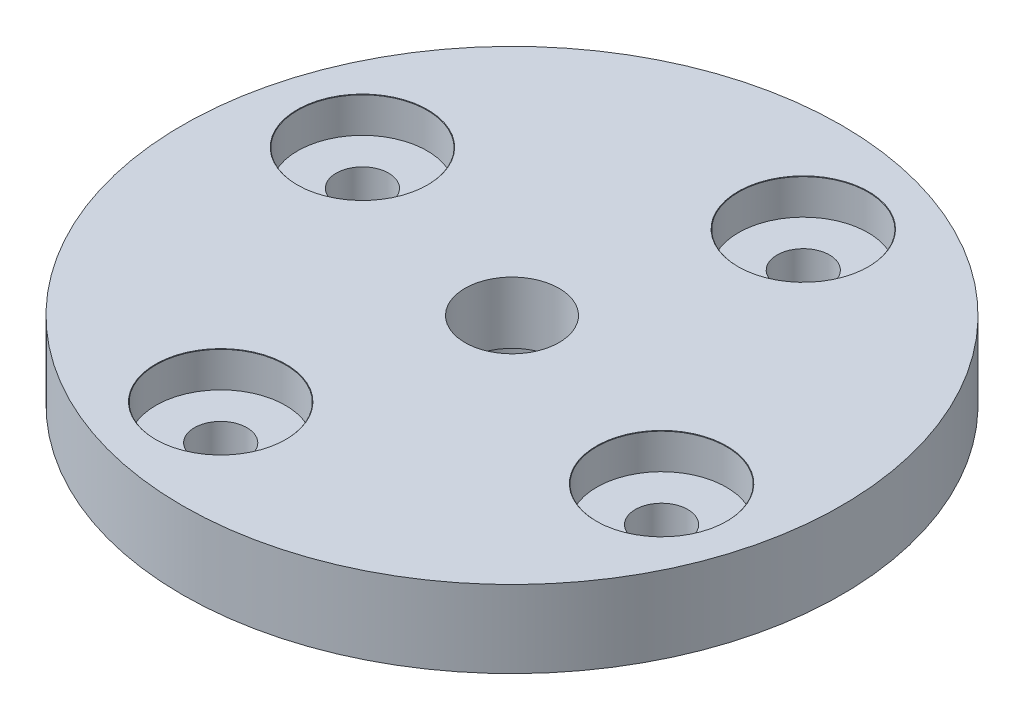
ISO-10303-21;
HEADER;
FILE_DESCRIPTION(('STEP AP214'),'2;1');
FILE_NAME('part.step','',(''),(''),'','','');
FILE_SCHEMA(('AUTOMOTIVE_DESIGN { 1 0 10303 214 1 1 1 1 }'));
ENDSEC;
DATA;
#1=APPLICATION_CONTEXT('core data for automotive mechanical design processes');
#2=APPLICATION_PROTOCOL_DEFINITION('international standard','automotive_design',2000,#1);
#3=PRODUCT_CONTEXT('',#1,'mechanical');
#4=PRODUCT('Part','Part','',(#3));
#5=PRODUCT_RELATED_PRODUCT_CATEGORY('part','',(#4));
#6=PRODUCT_DEFINITION_FORMATION('','',#4);
#7=PRODUCT_DEFINITION_CONTEXT('part definition',#1,'design');
#8=PRODUCT_DEFINITION('design','',#6,#7);
#9=PRODUCT_DEFINITION_SHAPE('','',#8);
#10=(LENGTH_UNIT() NAMED_UNIT(*) SI_UNIT(.MILLI.,.METRE.));
#11=(NAMED_UNIT(*) PLANE_ANGLE_UNIT() SI_UNIT($,.RADIAN.));
#12=(NAMED_UNIT(*) SI_UNIT($,.STERADIAN.) SOLID_ANGLE_UNIT());
#13=UNCERTAINTY_MEASURE_WITH_UNIT(LENGTH_MEASURE(1.E-05),#10,'distance_accuracy_value','');
#14=(GEOMETRIC_REPRESENTATION_CONTEXT(3) GLOBAL_UNCERTAINTY_ASSIGNED_CONTEXT((#13)) GLOBAL_UNIT_ASSIGNED_CONTEXT((#10,
#11,#12)) REPRESENTATION_CONTEXT('',''));
#15=CARTESIAN_POINT('',(0.,0.,0.));
#16=DIRECTION('',(0.,0.,1.));
#17=DIRECTION('',(1.,0.,0.));
#18=AXIS2_PLACEMENT_3D('',#15,#16,#17);
#19=CARTESIAN_POINT('',(21.35,0.,0.));
#20=DIRECTION('',(0.,-1.,0.));
#21=DIRECTION('',(0.,0.,-1.));
#22=AXIS2_PLACEMENT_3D('',#19,#20,#21);
#23=PLANE('',#22);
#24=CARTESIAN_POINT('',(4.59022107462861,0.,-14.2804016220145));
#25=DIRECTION('',(0.,1.,0.));
#26=DIRECTION('',(0.,0.,1.));
#27=AXIS2_PLACEMENT_3D('',#24,#25,#26);
#28=CIRCLE('',#27,1.7);
#29=CARTESIAN_POINT('',(4.59022107462861,0.,-12.5804016220145));
#30=VERTEX_POINT('',#29);
#31=EDGE_CURVE('E110',#30,#30,#28,.T.);
#32=ORIENTED_EDGE('',*,*,#31,.T.);
#33=EDGE_LOOP('',(#32));
#34=FACE_BOUND('',#33,.T.);
#35=CARTESIAN_POINT('',(-14.2804016220145,0.,-4.59022107462861));
#36=DIRECTION('',(0.,1.,0.));
#37=DIRECTION('',(0.,0.,1.));
#38=AXIS2_PLACEMENT_3D('',#35,#36,#37);
#39=CIRCLE('',#38,1.7);
#40=CARTESIAN_POINT('',(-14.2804016220145,0.,-2.89022107462861));
#41=VERTEX_POINT('',#40);
#42=EDGE_CURVE('E95',#41,#41,#39,.T.);
#43=ORIENTED_EDGE('',*,*,#42,.T.);
#44=EDGE_LOOP('',(#43));
#45=FACE_BOUND('',#44,.T.);
#46=CARTESIAN_POINT('',(14.2804016220145,0.,4.59022107462861));
#47=DIRECTION('',(0.,1.,0.));
#48=DIRECTION('',(0.,0.,1.));
#49=AXIS2_PLACEMENT_3D('',#46,#47,#48);
#50=CIRCLE('',#49,1.7);
#51=CARTESIAN_POINT('',(14.2804016220145,0.,6.2902210746286));
#52=VERTEX_POINT('',#51);
#53=EDGE_CURVE('E76',#52,#52,#50,.T.);
#54=ORIENTED_EDGE('',*,*,#53,.T.);
#55=EDGE_LOOP('',(#54));
#56=FACE_BOUND('',#55,.T.);
#57=CARTESIAN_POINT('',(-4.59022107462861,0.,14.2804016220145));
#58=DIRECTION('',(0.,1.,0.));
#59=DIRECTION('',(0.,0.,1.));
#60=AXIS2_PLACEMENT_3D('',#57,#58,#59);
#61=CIRCLE('',#60,1.7);
#62=CARTESIAN_POINT('',(-4.59022107462861,0.,15.9804016220145));
#63=VERTEX_POINT('',#62);
#64=EDGE_CURVE('E61',#63,#63,#61,.T.);
#65=ORIENTED_EDGE('',*,*,#64,.T.);
#66=EDGE_LOOP('',(#65));
#67=FACE_BOUND('',#66,.T.);
#68=CARTESIAN_POINT('',(0.,0.,0.));
#69=DIRECTION('',(0.,-1.,0.));
#70=DIRECTION('',(0.,0.,-1.));
#71=AXIS2_PLACEMENT_3D('',#68,#69,#70);
#72=CIRCLE('',#71,21.35);
#73=CARTESIAN_POINT('',(0.,0.,-21.35));
#74=VERTEX_POINT('',#73);
#75=EDGE_CURVE('E56',#74,#74,#72,.T.);
#76=ORIENTED_EDGE('',*,*,#75,.T.);
#77=EDGE_LOOP('',(#76));
#78=FACE_BOUND('',#77,.T.);
#79=CARTESIAN_POINT('',(0.,0.,0.));
#80=DIRECTION('',(0.,-1.,0.));
#81=DIRECTION('',(0.,0.,-1.));
#82=AXIS2_PLACEMENT_3D('',#79,#80,#81);
#83=CIRCLE('',#82,4.);
#84=CARTESIAN_POINT('',(0.,0.,-4.));
#85=VERTEX_POINT('',#84);
#86=EDGE_CURVE('E10',#85,#85,#83,.T.);
#87=ORIENTED_EDGE('',*,*,#86,.F.);
#88=EDGE_LOOP('',(#87));
#89=FACE_BOUND('',#88,.T.);
#90=ADVANCED_FACE('F40',(#34,#45,#56,#67,#78,#89),#23,.T.);
#91=CARTESIAN_POINT('',(0.,0.,0.));
#92=DIRECTION('',(0.,-1.,0.));
#93=DIRECTION('',(0.,0.,-1.));
#94=AXIS2_PLACEMENT_3D('',#91,#92,#93);
#95=CYLINDRICAL_SURFACE('',#94,4.);
#96=ORIENTED_EDGE('',*,*,#86,.T.);
#97=EDGE_LOOP('',(#96));
#98=FACE_BOUND('',#97,.T.);
#99=CARTESIAN_POINT('',(0.,0.999999999999997,0.));
#100=DIRECTION('',(0.,-1.,0.));
#101=DIRECTION('',(0.,0.,-1.));
#102=AXIS2_PLACEMENT_3D('',#99,#100,#101);
#103=CIRCLE('',#102,4.);
#104=CARTESIAN_POINT('',(0.,0.999999999999997,-4.));
#105=VERTEX_POINT('',#104);
#106=EDGE_CURVE('E43',#105,#105,#103,.T.);
#107=ORIENTED_EDGE('',*,*,#106,.F.);
#108=EDGE_LOOP('',(#107));
#109=FACE_BOUND('',#108,.T.);
#110=ADVANCED_FACE('F149',(#98,#109),#95,.F.);
#111=CARTESIAN_POINT('',(4.,0.999999999999997,0.));
#112=DIRECTION('',(0.,-1.,0.));
#113=DIRECTION('',(0.,0.,-1.));
#114=AXIS2_PLACEMENT_3D('',#111,#112,#113);
#115=PLANE('',#114);
#116=ORIENTED_EDGE('',*,*,#106,.T.);
#117=EDGE_LOOP('',(#116));
#118=FACE_BOUND('',#117,.T.);
#119=CARTESIAN_POINT('',(0.,0.999999999999997,0.));
#120=DIRECTION('',(0.,-1.,0.));
#121=DIRECTION('',(0.,0.,-1.));
#122=AXIS2_PLACEMENT_3D('',#119,#120,#121);
#123=CIRCLE('',#122,3.048);
#124=CARTESIAN_POINT('',(0.,0.999999999999997,-3.048));
#125=VERTEX_POINT('',#124);
#126=EDGE_CURVE('E50',#125,#125,#123,.T.);
#127=ORIENTED_EDGE('',*,*,#126,.F.);
#128=EDGE_LOOP('',(#127));
#129=FACE_BOUND('',#128,.T.);
#130=ADVANCED_FACE('F152',(#118,#129),#115,.T.);
#131=CARTESIAN_POINT('',(0.,0.,0.));
#132=DIRECTION('',(0.,-1.,0.));
#133=DIRECTION('',(0.,0.,-1.));
#134=AXIS2_PLACEMENT_3D('',#131,#132,#133);
#135=CYLINDRICAL_SURFACE('',#134,3.048);
#136=ORIENTED_EDGE('',*,*,#126,.T.);
#137=EDGE_LOOP('',(#136));
#138=FACE_BOUND('',#137,.T.);
#139=CARTESIAN_POINT('',(0.,5.,0.));
#140=DIRECTION('',(0.,-1.,0.));
#141=DIRECTION('',(0.,0.,-1.));
#142=AXIS2_PLACEMENT_3D('',#139,#140,#141);
#143=CIRCLE('',#142,3.048);
#144=CARTESIAN_POINT('',(0.,5.,-3.048));
#145=VERTEX_POINT('',#144);
#146=EDGE_CURVE('E51',#145,#145,#143,.T.);
#147=ORIENTED_EDGE('',*,*,#146,.F.);
#148=EDGE_LOOP('',(#147));
#149=FACE_BOUND('',#148,.T.);
#150=ADVANCED_FACE('F129',(#138,#149),#135,.F.);
#151=CARTESIAN_POINT('',(21.35,5.,0.));
#152=DIRECTION('',(0.,1.,0.));
#153=DIRECTION('',(0.,0.,1.));
#154=AXIS2_PLACEMENT_3D('',#151,#152,#153);
#155=PLANE('',#154);
#156=CARTESIAN_POINT('',(4.59022107462861,5.,-14.2804016220145));
#157=DIRECTION('',(0.,1.,0.));
#158=DIRECTION('',(0.,0.,1.));
#159=AXIS2_PLACEMENT_3D('',#156,#157,#158);
#160=CIRCLE('',#159,4.225);
#161=CARTESIAN_POINT('',(4.59022107462861,5.,-10.0554016220145));
#162=VERTEX_POINT('',#161);
#163=EDGE_CURVE('E118',#162,#162,#160,.T.);
#164=ORIENTED_EDGE('',*,*,#163,.F.);
#165=EDGE_LOOP('',(#164));
#166=FACE_BOUND('',#165,.T.);
#167=CARTESIAN_POINT('',(-14.2804016220145,5.,-4.59022107462861));
#168=DIRECTION('',(0.,1.,0.));
#169=DIRECTION('',(0.,0.,1.));
#170=AXIS2_PLACEMENT_3D('',#167,#168,#169);
#171=CIRCLE('',#170,4.225);
#172=CARTESIAN_POINT('',(-14.2804016220145,5.,-0.36522107462861));
#173=VERTEX_POINT('',#172);
#174=EDGE_CURVE('E102',#173,#173,#171,.T.);
#175=ORIENTED_EDGE('',*,*,#174,.F.);
#176=EDGE_LOOP('',(#175));
#177=FACE_BOUND('',#176,.T.);
#178=CARTESIAN_POINT('',(14.2804016220145,5.,4.59022107462861));
#179=DIRECTION('',(0.,1.,0.));
#180=DIRECTION('',(0.,0.,1.));
#181=AXIS2_PLACEMENT_3D('',#178,#179,#180);
#182=CIRCLE('',#181,4.225);
#183=CARTESIAN_POINT('',(14.2804016220145,5.,8.8152210746286));
#184=VERTEX_POINT('',#183);
#185=EDGE_CURVE('E90',#184,#184,#182,.T.);
#186=ORIENTED_EDGE('',*,*,#185,.F.);
#187=EDGE_LOOP('',(#186));
#188=FACE_BOUND('',#187,.T.);
#189=CARTESIAN_POINT('',(-4.59022107462861,5.,14.2804016220145));
#190=DIRECTION('',(0.,1.,0.));
#191=DIRECTION('',(0.,0.,1.));
#192=AXIS2_PLACEMENT_3D('',#189,#190,#191);
#193=CIRCLE('',#192,4.225);
#194=CARTESIAN_POINT('',(-4.59022107462861,5.,18.5054016220145));
#195=VERTEX_POINT('',#194);
#196=EDGE_CURVE('E74',#195,#195,#193,.T.);
#197=ORIENTED_EDGE('',*,*,#196,.F.);
#198=EDGE_LOOP('',(#197));
#199=FACE_BOUND('',#198,.T.);
#200=ORIENTED_EDGE('',*,*,#146,.T.);
#201=EDGE_LOOP('',(#200));
#202=FACE_BOUND('',#201,.T.);
#203=CARTESIAN_POINT('',(0.,5.,0.));
#204=DIRECTION('',(0.,-1.,0.));
#205=DIRECTION('',(0.,0.,-1.));
#206=AXIS2_PLACEMENT_3D('',#203,#204,#205);
#207=CIRCLE('',#206,21.35);
#208=CARTESIAN_POINT('',(0.,5.,-21.35));
#209=VERTEX_POINT('',#208);
#210=EDGE_CURVE('E57',#209,#209,#207,.T.);
#211=ORIENTED_EDGE('',*,*,#210,.F.);
#212=EDGE_LOOP('',(#211));
#213=FACE_BOUND('',#212,.T.);
#214=ADVANCED_FACE('F124',(#166,#177,#188,#199,#202,#213),#155,.T.);
#215=CARTESIAN_POINT('',(0.,0.,0.));
#216=DIRECTION('',(0.,-1.,0.));
#217=DIRECTION('',(0.,0.,-1.));
#218=AXIS2_PLACEMENT_3D('',#215,#216,#217);
#219=CYLINDRICAL_SURFACE('',#218,21.35);
#220=ORIENTED_EDGE('',*,*,#210,.T.);
#221=EDGE_LOOP('',(#220));
#222=FACE_BOUND('',#221,.T.);
#223=ORIENTED_EDGE('',*,*,#75,.F.);
#224=EDGE_LOOP('',(#223));
#225=FACE_BOUND('',#224,.T.);
#226=ADVANCED_FACE('F126',(#222,#225),#219,.T.);
#227=CARTESIAN_POINT('',(-4.59022107462861,5.,14.2804016220145));
#228=DIRECTION('',(0.,1.,0.));
#229=DIRECTION('',(0.,0.,1.));
#230=AXIS2_PLACEMENT_3D('',#227,#228,#229);
#231=CYLINDRICAL_SURFACE('',#230,1.70000000000001);
#232=ORIENTED_EDGE('',*,*,#64,.F.);
#233=EDGE_LOOP('',(#232));
#234=FACE_BOUND('',#233,.T.);
#235=CARTESIAN_POINT('',(-4.59022107462861,2.70000000000001,14.2804016220145));
#236=DIRECTION('',(0.,1.,0.));
#237=DIRECTION('',(0.,0.,1.));
#238=AXIS2_PLACEMENT_3D('',#235,#236,#237);
#239=CIRCLE('',#238,1.70000000000001);
#240=CARTESIAN_POINT('',(-4.59022107462861,2.70000000000001,15.9804016220145));
#241=VERTEX_POINT('',#240);
#242=EDGE_CURVE('E62',#241,#241,#239,.T.);
#243=ORIENTED_EDGE('',*,*,#242,.T.);
#244=EDGE_LOOP('',(#243));
#245=FACE_BOUND('',#244,.T.);
#246=ADVANCED_FACE('F141',(#234,#245),#231,.F.);
#247=CARTESIAN_POINT('',(-0.390221074628614,2.70000000000001,14.2804016220145));
#248=DIRECTION('',(0.,-1.,0.));
#249=DIRECTION('',(0.,0.,-1.));
#250=AXIS2_PLACEMENT_3D('',#247,#248,#249);
#251=PLANE('',#250);
#252=ORIENTED_EDGE('',*,*,#242,.F.);
#253=EDGE_LOOP('',(#252));
#254=FACE_BOUND('',#253,.T.);
#255=CARTESIAN_POINT('',(-4.59022107462861,2.70000000000001,14.2804016220145));
#256=DIRECTION('',(0.,1.,0.));
#257=DIRECTION('',(0.,0.,1.));
#258=AXIS2_PLACEMENT_3D('',#255,#256,#257);
#259=CIRCLE('',#258,4.2);
#260=CARTESIAN_POINT('',(-4.59022107462861,2.70000000000001,18.4804016220145));
#261=VERTEX_POINT('',#260);
#262=EDGE_CURVE('E68',#261,#261,#259,.T.);
#263=ORIENTED_EDGE('',*,*,#262,.T.);
#264=EDGE_LOOP('',(#263));
#265=FACE_BOUND('',#264,.T.);
#266=ADVANCED_FACE('F164',(#254,#265),#251,.F.);
#267=CARTESIAN_POINT('',(-4.59022107462861,5.,14.2804016220145));
#268=DIRECTION('',(0.,1.,0.));
#269=DIRECTION('',(0.,0.,1.));
#270=AXIS2_PLACEMENT_3D('',#267,#268,#269);
#271=CYLINDRICAL_SURFACE('',#270,4.2);
#272=ORIENTED_EDGE('',*,*,#262,.F.);
#273=EDGE_LOOP('',(#272));
#274=FACE_BOUND('',#273,.T.);
#275=CARTESIAN_POINT('',(-4.59022107462861,4.97500000000001,14.2804016220145));
#276=DIRECTION('',(0.,1.,0.));
#277=DIRECTION('',(0.,0.,1.));
#278=AXIS2_PLACEMENT_3D('',#275,#276,#277);
#279=CIRCLE('',#278,4.2);
#280=CARTESIAN_POINT('',(-4.59022107462861,4.97500000000001,18.4804016220145));
#281=VERTEX_POINT('',#280);
#282=EDGE_CURVE('E72',#281,#281,#279,.T.);
#283=ORIENTED_EDGE('',*,*,#282,.T.);
#284=EDGE_LOOP('',(#283));
#285=FACE_BOUND('',#284,.T.);
#286=ADVANCED_FACE('F174',(#274,#285),#271,.F.);
#287=CARTESIAN_POINT('',(-4.59022107462861,5.,14.2804016220145));
#288=DIRECTION('',(0.,1.,0.));
#289=DIRECTION('',(0.,0.,1.));
#290=AXIS2_PLACEMENT_3D('',#287,#288,#289);
#291=CONICAL_SURFACE('',#290,4.225,0.785398163397552);
#292=ORIENTED_EDGE('',*,*,#282,.F.);
#293=EDGE_LOOP('',(#292));
#294=FACE_BOUND('',#293,.T.);
#295=ORIENTED_EDGE('',*,*,#196,.T.);
#296=EDGE_LOOP('',(#295));
#297=FACE_BOUND('',#296,.T.);
#298=ADVANCED_FACE('F180',(#294,#297),#291,.F.);
#299=CARTESIAN_POINT('',(14.2804016220145,5.,4.59022107462861));
#300=DIRECTION('',(0.,1.,0.));
#301=DIRECTION('',(0.,0.,1.));
#302=AXIS2_PLACEMENT_3D('',#299,#300,#301);
#303=CYLINDRICAL_SURFACE('',#302,1.70000000000001);
#304=ORIENTED_EDGE('',*,*,#53,.F.);
#305=EDGE_LOOP('',(#304));
#306=FACE_BOUND('',#305,.T.);
#307=CARTESIAN_POINT('',(14.2804016220145,2.70000000000001,4.59022107462861));
#308=DIRECTION('',(0.,1.,0.));
#309=DIRECTION('',(0.,0.,1.));
#310=AXIS2_PLACEMENT_3D('',#307,#308,#309);
#311=CIRCLE('',#310,1.70000000000001);
#312=CARTESIAN_POINT('',(14.2804016220145,2.70000000000001,6.29022107462862));
#313=VERTEX_POINT('',#312);
#314=EDGE_CURVE('E77',#313,#313,#311,.T.);
#315=ORIENTED_EDGE('',*,*,#314,.T.);
#316=EDGE_LOOP('',(#315));
#317=FACE_BOUND('',#316,.T.);
#318=ADVANCED_FACE('F181',(#306,#317),#303,.F.);
#319=CARTESIAN_POINT('',(18.4804016220145,2.70000000000001,4.59022107462861));
#320=DIRECTION('',(0.,-1.,0.));
#321=DIRECTION('',(0.,0.,-1.));
#322=AXIS2_PLACEMENT_3D('',#319,#320,#321);
#323=PLANE('',#322);
#324=ORIENTED_EDGE('',*,*,#314,.F.);
#325=EDGE_LOOP('',(#324));
#326=FACE_BOUND('',#325,.T.);
#327=CARTESIAN_POINT('',(14.2804016220145,2.70000000000001,4.59022107462861));
#328=DIRECTION('',(0.,1.,0.));
#329=DIRECTION('',(0.,0.,1.));
#330=AXIS2_PLACEMENT_3D('',#327,#328,#329);
#331=CIRCLE('',#330,4.2);
#332=CARTESIAN_POINT('',(14.2804016220145,2.70000000000001,8.7902210746286));
#333=VERTEX_POINT('',#332);
#334=EDGE_CURVE('E83',#333,#333,#331,.T.);
#335=ORIENTED_EDGE('',*,*,#334,.T.);
#336=EDGE_LOOP('',(#335));
#337=FACE_BOUND('',#336,.T.);
#338=ADVANCED_FACE('F190',(#326,#337),#323,.F.);
#339=CARTESIAN_POINT('',(14.2804016220145,5.,4.59022107462861));
#340=DIRECTION('',(0.,1.,0.));
#341=DIRECTION('',(0.,0.,1.));
#342=AXIS2_PLACEMENT_3D('',#339,#340,#341);
#343=CYLINDRICAL_SURFACE('',#342,4.2);
#344=ORIENTED_EDGE('',*,*,#334,.F.);
#345=EDGE_LOOP('',(#344));
#346=FACE_BOUND('',#345,.T.);
#347=CARTESIAN_POINT('',(14.2804016220145,4.97500000000001,4.59022107462861));
#348=DIRECTION('',(0.,1.,0.));
#349=DIRECTION('',(0.,0.,1.));
#350=AXIS2_PLACEMENT_3D('',#347,#348,#349);
#351=CIRCLE('',#350,4.2);
#352=CARTESIAN_POINT('',(14.2804016220145,4.97500000000001,8.7902210746286));
#353=VERTEX_POINT('',#352);
#354=EDGE_CURVE('E88',#353,#353,#351,.T.);
#355=ORIENTED_EDGE('',*,*,#354,.T.);
#356=EDGE_LOOP('',(#355));
#357=FACE_BOUND('',#356,.T.);
#358=ADVANCED_FACE('F258',(#346,#357),#343,.F.);
#359=CARTESIAN_POINT('',(14.2804016220145,5.,4.59022107462861));
#360=DIRECTION('',(0.,1.,0.));
#361=DIRECTION('',(0.,0.,1.));
#362=AXIS2_PLACEMENT_3D('',#359,#360,#361);
#363=CONICAL_SURFACE('',#362,4.225,0.785398163397552);
#364=ORIENTED_EDGE('',*,*,#354,.F.);
#365=EDGE_LOOP('',(#364));
#366=FACE_BOUND('',#365,.T.);
#367=ORIENTED_EDGE('',*,*,#185,.T.);
#368=EDGE_LOOP('',(#367));
#369=FACE_BOUND('',#368,.T.);
#370=ADVANCED_FACE('F264',(#366,#369),#363,.F.);
#371=CARTESIAN_POINT('',(-14.2804016220145,5.,-4.59022107462861));
#372=DIRECTION('',(0.,1.,0.));
#373=DIRECTION('',(0.,0.,1.));
#374=AXIS2_PLACEMENT_3D('',#371,#372,#373);
#375=CYLINDRICAL_SURFACE('',#374,1.70000000000001);
#376=ORIENTED_EDGE('',*,*,#42,.F.);
#377=EDGE_LOOP('',(#376));
#378=FACE_BOUND('',#377,.T.);
#379=CARTESIAN_POINT('',(-14.2804016220145,2.70000000000001,-4.59022107462861));
#380=DIRECTION('',(0.,1.,0.));
#381=DIRECTION('',(0.,0.,1.));
#382=AXIS2_PLACEMENT_3D('',#379,#380,#381);
#383=CIRCLE('',#382,1.70000000000001);
#384=CARTESIAN_POINT('',(-14.2804016220145,2.70000000000001,-2.8902210746286));
#385=VERTEX_POINT('',#384);
#386=EDGE_CURVE('E92',#385,#385,#383,.T.);
#387=ORIENTED_EDGE('',*,*,#386,.T.);
#388=EDGE_LOOP('',(#387));
#389=FACE_BOUND('',#388,.T.);
#390=ADVANCED_FACE('F274',(#378,#389),#375,.F.);
#391=CARTESIAN_POINT('',(-10.0804016220145,2.70000000000001,-4.59022107462861));
#392=DIRECTION('',(0.,-1.,0.));
#393=DIRECTION('',(0.,0.,-1.));
#394=AXIS2_PLACEMENT_3D('',#391,#392,#393);
#395=PLANE('',#394);
#396=ORIENTED_EDGE('',*,*,#386,.F.);
#397=EDGE_LOOP('',(#396));
#398=FACE_BOUND('',#397,.T.);
#399=CARTESIAN_POINT('',(-14.2804016220145,2.70000000000001,-4.59022107462861));
#400=DIRECTION('',(0.,1.,0.));
#401=DIRECTION('',(0.,0.,1.));
#402=AXIS2_PLACEMENT_3D('',#399,#400,#401);
#403=CIRCLE('',#402,4.2);
#404=CARTESIAN_POINT('',(-14.2804016220145,2.70000000000001,-0.390221074628615));
#405=VERTEX_POINT('',#404);
#406=EDGE_CURVE('E98',#405,#405,#403,.T.);
#407=ORIENTED_EDGE('',*,*,#406,.T.);
#408=EDGE_LOOP('',(#407));
#409=FACE_BOUND('',#408,.T.);
#410=ADVANCED_FACE('F282',(#398,#409),#395,.F.);
#411=CARTESIAN_POINT('',(-14.2804016220145,5.,-4.59022107462861));
#412=DIRECTION('',(0.,1.,0.));
#413=DIRECTION('',(0.,0.,1.));
#414=AXIS2_PLACEMENT_3D('',#411,#412,#413);
#415=CYLINDRICAL_SURFACE('',#414,4.2);
#416=ORIENTED_EDGE('',*,*,#406,.F.);
#417=EDGE_LOOP('',(#416));
#418=FACE_BOUND('',#417,.T.);
#419=CARTESIAN_POINT('',(-14.2804016220145,4.97500000000001,-4.59022107462861));
#420=DIRECTION('',(0.,1.,0.));
#421=DIRECTION('',(0.,0.,1.));
#422=AXIS2_PLACEMENT_3D('',#419,#420,#421);
#423=CIRCLE('',#422,4.2);
#424=CARTESIAN_POINT('',(-14.2804016220145,4.97500000000001,-0.390221074628611));
#425=VERTEX_POINT('',#424);
#426=EDGE_CURVE('E101',#425,#425,#423,.T.);
#427=ORIENTED_EDGE('',*,*,#426,.T.);
#428=EDGE_LOOP('',(#427));
#429=FACE_BOUND('',#428,.T.);
#430=ADVANCED_FACE('F293',(#418,#429),#415,.F.);
#431=CARTESIAN_POINT('',(-14.2804016220145,5.,-4.59022107462861));
#432=DIRECTION('',(0.,1.,0.));
#433=DIRECTION('',(0.,0.,1.));
#434=AXIS2_PLACEMENT_3D('',#431,#432,#433);
#435=CONICAL_SURFACE('',#434,4.225,0.785398163397552);
#436=ORIENTED_EDGE('',*,*,#426,.F.);
#437=EDGE_LOOP('',(#436));
#438=FACE_BOUND('',#437,.T.);
#439=ORIENTED_EDGE('',*,*,#174,.T.);
#440=EDGE_LOOP('',(#439));
#441=FACE_BOUND('',#440,.T.);
#442=ADVANCED_FACE('F304',(#438,#441),#435,.F.);
#443=CARTESIAN_POINT('',(4.59022107462861,5.,-14.2804016220145));
#444=DIRECTION('',(0.,1.,0.));
#445=DIRECTION('',(0.,0.,1.));
#446=AXIS2_PLACEMENT_3D('',#443,#444,#445);
#447=CYLINDRICAL_SURFACE('',#446,1.70000000000001);
#448=ORIENTED_EDGE('',*,*,#31,.F.);
#449=EDGE_LOOP('',(#448));
#450=FACE_BOUND('',#449,.T.);
#451=CARTESIAN_POINT('',(4.59022107462861,2.70000000000001,-14.2804016220145));
#452=DIRECTION('',(0.,1.,0.));
#453=DIRECTION('',(0.,0.,1.));
#454=AXIS2_PLACEMENT_3D('',#451,#452,#453);
#455=CIRCLE('',#454,1.70000000000001);
#456=CARTESIAN_POINT('',(4.59022107462861,2.70000000000001,-12.5804016220145));
#457=VERTEX_POINT('',#456);
#458=EDGE_CURVE('E109',#457,#457,#455,.T.);
#459=ORIENTED_EDGE('',*,*,#458,.T.);
#460=EDGE_LOOP('',(#459));
#461=FACE_BOUND('',#460,.T.);
#462=ADVANCED_FACE('F312',(#450,#461),#447,.F.);
#463=CARTESIAN_POINT('',(8.7902210746286,2.70000000000001,-14.2804016220145));
#464=DIRECTION('',(0.,-1.,0.));
#465=DIRECTION('',(0.,0.,-1.));
#466=AXIS2_PLACEMENT_3D('',#463,#464,#465);
#467=PLANE('',#466);
#468=ORIENTED_EDGE('',*,*,#458,.F.);
#469=EDGE_LOOP('',(#468));
#470=FACE_BOUND('',#469,.T.);
#471=CARTESIAN_POINT('',(4.59022107462861,2.70000000000001,-14.2804016220145));
#472=DIRECTION('',(0.,1.,0.));
#473=DIRECTION('',(0.,0.,1.));
#474=AXIS2_PLACEMENT_3D('',#471,#472,#473);
#475=CIRCLE('',#474,4.2);
#476=CARTESIAN_POINT('',(4.59022107462861,2.70000000000001,-10.0804016220145));
#477=VERTEX_POINT('',#476);
#478=EDGE_CURVE('E114',#477,#477,#475,.T.);
#479=ORIENTED_EDGE('',*,*,#478,.T.);
#480=EDGE_LOOP('',(#479));
#481=FACE_BOUND('',#480,.T.);
#482=ADVANCED_FACE('F324',(#470,#481),#467,.F.);
#483=CARTESIAN_POINT('',(4.59022107462861,5.,-14.2804016220145));
#484=DIRECTION('',(0.,1.,0.));
#485=DIRECTION('',(0.,0.,1.));
#486=AXIS2_PLACEMENT_3D('',#483,#484,#485);
#487=CYLINDRICAL_SURFACE('',#486,4.2);
#488=ORIENTED_EDGE('',*,*,#478,.F.);
#489=EDGE_LOOP('',(#488));
#490=FACE_BOUND('',#489,.T.);
#491=CARTESIAN_POINT('',(4.59022107462861,4.97500000000001,-14.2804016220145));
#492=DIRECTION('',(0.,1.,0.));
#493=DIRECTION('',(0.,0.,1.));
#494=AXIS2_PLACEMENT_3D('',#491,#492,#493);
#495=CIRCLE('',#494,4.2);
#496=CARTESIAN_POINT('',(4.59022107462861,4.97500000000001,-10.0804016220145));
#497=VERTEX_POINT('',#496);
#498=EDGE_CURVE('E119',#497,#497,#495,.T.);
#499=ORIENTED_EDGE('',*,*,#498,.T.);
#500=EDGE_LOOP('',(#499));
#501=FACE_BOUND('',#500,.T.);
#502=ADVANCED_FACE('F333',(#490,#501),#487,.F.);
#503=CARTESIAN_POINT('',(4.59022107462861,5.,-14.2804016220145));
#504=DIRECTION('',(0.,1.,0.));
#505=DIRECTION('',(0.,0.,1.));
#506=AXIS2_PLACEMENT_3D('',#503,#504,#505);
#507=CONICAL_SURFACE('',#506,4.225,0.785398163397552);
#508=ORIENTED_EDGE('',*,*,#498,.F.);
#509=EDGE_LOOP('',(#508));
#510=FACE_BOUND('',#509,.T.);
#511=ORIENTED_EDGE('',*,*,#163,.T.);
#512=EDGE_LOOP('',(#511));
#513=FACE_BOUND('',#512,.T.);
#514=ADVANCED_FACE('F123',(#510,#513),#507,.F.);
#515=CLOSED_SHELL('',(#90,#110,#130,#150,#214,#226,#246,#266,#286,#298,#318,#338,#358,#370,#390,
#410,#430,#442,#462,#482,#502,#514));
#516=MANIFOLD_SOLID_BREP('B2',#515);
#517=ADVANCED_BREP_SHAPE_REPRESENTATION('',(#18,#516),#14);
#518=SHAPE_DEFINITION_REPRESENTATION(#9,#517);
ENDSEC;
END-ISO-10303-21;
